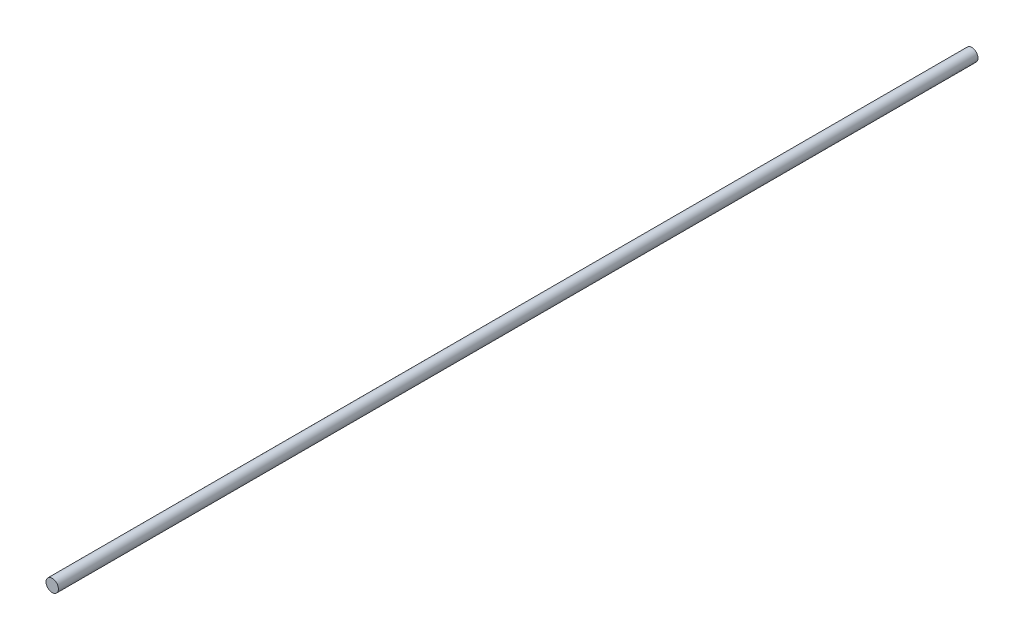
ISO-10303-21;
HEADER;
FILE_DESCRIPTION(('STEP AP214'),'2;1');
FILE_NAME('part.step','',(''),(''),'','','');
FILE_SCHEMA(('AUTOMOTIVE_DESIGN { 1 0 10303 214 1 1 1 1 }'));
ENDSEC;
DATA;
#1=APPLICATION_CONTEXT('core data for automotive mechanical design processes');
#2=APPLICATION_PROTOCOL_DEFINITION('international standard','automotive_design',2000,#1);
#3=PRODUCT_CONTEXT('',#1,'mechanical');
#4=PRODUCT('Part','Part','',(#3));
#5=PRODUCT_RELATED_PRODUCT_CATEGORY('part','',(#4));
#6=PRODUCT_DEFINITION_FORMATION('','',#4);
#7=PRODUCT_DEFINITION_CONTEXT('part definition',#1,'design');
#8=PRODUCT_DEFINITION('design','',#6,#7);
#9=PRODUCT_DEFINITION_SHAPE('','',#8);
#10=(LENGTH_UNIT() NAMED_UNIT(*) SI_UNIT(.MILLI.,.METRE.));
#11=(NAMED_UNIT(*) PLANE_ANGLE_UNIT() SI_UNIT($,.RADIAN.));
#12=(NAMED_UNIT(*) SI_UNIT($,.STERADIAN.) SOLID_ANGLE_UNIT());
#13=UNCERTAINTY_MEASURE_WITH_UNIT(LENGTH_MEASURE(1.E-05),#10,'distance_accuracy_value','');
#14=(GEOMETRIC_REPRESENTATION_CONTEXT(3) GLOBAL_UNCERTAINTY_ASSIGNED_CONTEXT((#13)) GLOBAL_UNIT_ASSIGNED_CONTEXT((#10,
#11,#12)) REPRESENTATION_CONTEXT('',''));
#15=CARTESIAN_POINT('',(0.,0.,0.));
#16=DIRECTION('',(0.,0.,1.));
#17=DIRECTION('',(1.,0.,0.));
#18=AXIS2_PLACEMENT_3D('',#15,#16,#17);
#19=CARTESIAN_POINT('',(0.,0.,740.));
#20=DIRECTION('',(0.,0.,-1.));
#21=DIRECTION('',(-1.,0.,0.));
#22=AXIS2_PLACEMENT_3D('',#19,#20,#21);
#23=CYLINDRICAL_SURFACE('',#22,5.);
#24=CARTESIAN_POINT('',(0.,0.,740.));
#25=DIRECTION('',(0.,0.,1.));
#26=DIRECTION('',(1.,0.,0.));
#27=AXIS2_PLACEMENT_3D('',#24,#25,#26);
#28=CIRCLE('',#27,5.);
#29=CARTESIAN_POINT('',(5.,0.,740.));
#30=VERTEX_POINT('',#29);
#31=EDGE_CURVE('E10',#30,#30,#28,.T.);
#32=ORIENTED_EDGE('',*,*,#31,.F.);
#33=EDGE_LOOP('',(#32));
#34=FACE_BOUND('',#33,.T.);
#35=CARTESIAN_POINT('',(0.,0.,0.));
#36=DIRECTION('',(0.,0.,1.));
#37=DIRECTION('',(1.,0.,0.));
#38=AXIS2_PLACEMENT_3D('',#35,#36,#37);
#39=CIRCLE('',#38,5.);
#40=CARTESIAN_POINT('',(5.,0.,0.));
#41=VERTEX_POINT('',#40);
#42=EDGE_CURVE('E42',#41,#41,#39,.T.);
#43=ORIENTED_EDGE('',*,*,#42,.T.);
#44=EDGE_LOOP('',(#43));
#45=FACE_BOUND('',#44,.T.);
#46=ADVANCED_FACE('F39',(#34,#45),#23,.T.);
#47=CARTESIAN_POINT('',(0.,0.,740.));
#48=DIRECTION('',(0.,0.,1.));
#49=DIRECTION('',(1.,0.,0.));
#50=AXIS2_PLACEMENT_3D('',#47,#48,#49);
#51=PLANE('',#50);
#52=ORIENTED_EDGE('',*,*,#31,.T.);
#53=EDGE_LOOP('',(#52));
#54=FACE_BOUND('',#53,.T.);
#55=ADVANCED_FACE('F56',(#54),#51,.T.);
#56=CARTESIAN_POINT('',(0.,0.,0.));
#57=DIRECTION('',(0.,0.,1.));
#58=DIRECTION('',(1.,0.,0.));
#59=AXIS2_PLACEMENT_3D('',#56,#57,#58);
#60=PLANE('',#59);
#61=ORIENTED_EDGE('',*,*,#42,.F.);
#62=EDGE_LOOP('',(#61));
#63=FACE_BOUND('',#62,.T.);
#64=ADVANCED_FACE('F54',(#63),#60,.F.);
#65=CLOSED_SHELL('',(#46,#55,#64));
#66=MANIFOLD_SOLID_BREP('B2',#65);
#67=ADVANCED_BREP_SHAPE_REPRESENTATION('',(#18,#66),#14);
#68=SHAPE_DEFINITION_REPRESENTATION(#9,#67);
ENDSEC;
END-ISO-10303-21;
